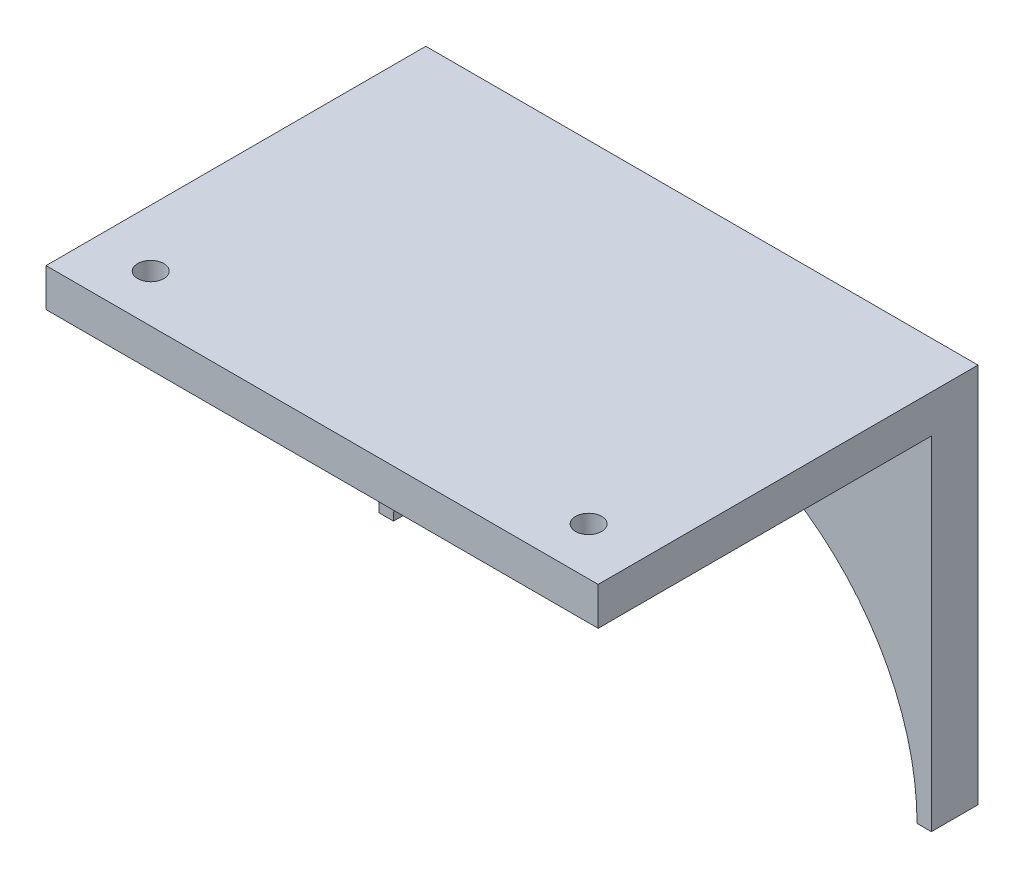
ISO-10303-21;
HEADER;
FILE_DESCRIPTION(('STEP AP214'),'2;1');
FILE_NAME('part.step','',(''),(''),'','','');
FILE_SCHEMA(('AUTOMOTIVE_DESIGN { 1 0 10303 214 1 1 1 1 }'));
ENDSEC;
DATA;
#1=APPLICATION_CONTEXT('core data for automotive mechanical design processes');
#2=APPLICATION_PROTOCOL_DEFINITION('international standard','automotive_design',2000,#1);
#3=PRODUCT_CONTEXT('',#1,'mechanical');
#4=PRODUCT('Part','Part','',(#3));
#5=PRODUCT_RELATED_PRODUCT_CATEGORY('part','',(#4));
#6=PRODUCT_DEFINITION_FORMATION('','',#4);
#7=PRODUCT_DEFINITION_CONTEXT('part definition',#1,'design');
#8=PRODUCT_DEFINITION('design','',#6,#7);
#9=PRODUCT_DEFINITION_SHAPE('','',#8);
#10=(LENGTH_UNIT() NAMED_UNIT(*) SI_UNIT(.MILLI.,.METRE.));
#11=(NAMED_UNIT(*) PLANE_ANGLE_UNIT() SI_UNIT($,.RADIAN.));
#12=(NAMED_UNIT(*) SI_UNIT($,.STERADIAN.) SOLID_ANGLE_UNIT());
#13=UNCERTAINTY_MEASURE_WITH_UNIT(LENGTH_MEASURE(1.E-05),#10,'distance_accuracy_value','');
#14=(GEOMETRIC_REPRESENTATION_CONTEXT(3) GLOBAL_UNCERTAINTY_ASSIGNED_CONTEXT((#13)) GLOBAL_UNIT_ASSIGNED_CONTEXT((#10,
#11,#12)) REPRESENTATION_CONTEXT('',''));
#15=CARTESIAN_POINT('',(0.,0.,0.));
#16=DIRECTION('',(0.,0.,1.));
#17=DIRECTION('',(1.,0.,0.));
#18=AXIS2_PLACEMENT_3D('',#15,#16,#17);
#19=CARTESIAN_POINT('',(0.,0.,1.8));
#20=DIRECTION('',(0.,0.,1.));
#21=DIRECTION('',(1.,0.,0.));
#22=AXIS2_PLACEMENT_3D('',#19,#20,#21);
#23=PLANE('',#22);
#24=DIRECTION('',(1.,0.,0.));
#25=VECTOR('',#24,1.);
#26=CARTESIAN_POINT('',(50.,0.,1.8));
#27=LINE('',#26,#25);
#28=CARTESIAN_POINT('',(50.,0.,1.8));
#29=VERTEX_POINT('',#28);
#30=CARTESIAN_POINT('',(55.,0.,1.8));
#31=VERTEX_POINT('',#30);
#32=EDGE_CURVE('E184',#29,#31,#27,.T.);
#33=ORIENTED_EDGE('',*,*,#32,.T.);
#34=CARTESIAN_POINT('',(0.,0.,1.8));
#35=DIRECTION('',(0.,0.,1.));
#36=DIRECTION('',(1.,0.,0.));
#37=AXIS2_PLACEMENT_3D('',#34,#35,#36);
#38=CIRCLE('',#37,55.);
#39=CARTESIAN_POINT('',(-55.,0.,1.8));
#40=VERTEX_POINT('',#39);
#41=EDGE_CURVE('E181',#31,#40,#38,.T.);
#42=ORIENTED_EDGE('',*,*,#41,.T.);
#43=DIRECTION('',(1.,0.,0.));
#44=VECTOR('',#43,1.);
#45=CARTESIAN_POINT('',(-50.,0.,1.8));
#46=LINE('',#45,#44);
#47=CARTESIAN_POINT('',(-50.,0.,1.8));
#48=VERTEX_POINT('',#47);
#49=EDGE_CURVE('E209',#40,#48,#46,.T.);
#50=ORIENTED_EDGE('',*,*,#49,.T.);
#51=CARTESIAN_POINT('',(0.,0.,1.8));
#52=DIRECTION('',(0.,0.,-1.));
#53=DIRECTION('',(1.,0.,0.));
#54=AXIS2_PLACEMENT_3D('',#51,#52,#53);
#55=CIRCLE('',#54,50.);
#56=EDGE_CURVE('E219',#48,#29,#55,.T.);
#57=ORIENTED_EDGE('',*,*,#56,.T.);
#58=EDGE_LOOP('',(#33,#42,#50,#57));
#59=FACE_BOUND('',#58,.T.);
#60=ADVANCED_FACE('F35',(#59),#23,.T.);
#61=CARTESIAN_POINT('',(58.,0.,1.8));
#62=DIRECTION('',(-1.,0.,0.));
#63=DIRECTION('',(0.,-1.,0.));
#64=AXIS2_PLACEMENT_3D('',#61,#62,#63);
#65=PLANE('',#64);
#66=DIRECTION('',(0.,1.,0.));
#67=VECTOR('',#66,1.);
#68=CARTESIAN_POINT('',(58.,0.,0.));
#69=LINE('',#68,#67);
#70=CARTESIAN_POINT('',(58.,0.,0.));
#71=VERTEX_POINT('',#70);
#72=CARTESIAN_POINT('',(58.,80.,0.));
#73=VERTEX_POINT('',#72);
#74=EDGE_CURVE('E190',#71,#73,#69,.T.);
#75=ORIENTED_EDGE('',*,*,#74,.T.);
#76=DIRECTION('',(0.,0.,-1.));
#77=VECTOR('',#76,1.);
#78=CARTESIAN_POINT('',(58.,80.,1.8));
#79=LINE('',#78,#77);
#80=CARTESIAN_POINT('',(58.,80.,79.8));
#81=VERTEX_POINT('',#80);
#82=EDGE_CURVE('E11',#81,#73,#79,.T.);
#83=ORIENTED_EDGE('',*,*,#82,.F.);
#84=DIRECTION('',(0.,1.,0.));
#85=VECTOR('',#84,1.);
#86=CARTESIAN_POINT('',(58.,72.,79.8));
#87=LINE('',#86,#85);
#88=CARTESIAN_POINT('',(58.,72.,79.8));
#89=VERTEX_POINT('',#88);
#90=EDGE_CURVE('E116',#89,#81,#87,.T.);
#91=ORIENTED_EDGE('',*,*,#90,.F.);
#92=DIRECTION('',(0.,0.,-1.));
#93=VECTOR('',#92,1.);
#94=CARTESIAN_POINT('',(58.,72.,0.));
#95=LINE('',#94,#93);
#96=CARTESIAN_POINT('',(58.,72.,9.8));
#97=VERTEX_POINT('',#96);
#98=EDGE_CURVE('E120',#89,#97,#95,.T.);
#99=ORIENTED_EDGE('',*,*,#98,.T.);
#100=DIRECTION('',(0.,1.,0.));
#101=VECTOR('',#100,1.);
#102=CARTESIAN_POINT('',(58.,0.,9.8));
#103=LINE('',#102,#101);
#104=CARTESIAN_POINT('',(58.,0.,9.8));
#105=VERTEX_POINT('',#104);
#106=EDGE_CURVE('E162',#105,#97,#103,.T.);
#107=ORIENTED_EDGE('',*,*,#106,.F.);
#108=DIRECTION('',(0.,0.,-1.));
#109=VECTOR('',#108,1.);
#110=CARTESIAN_POINT('',(58.,0.,1.8));
#111=LINE('',#110,#109);
#112=EDGE_CURVE('E210',#105,#71,#111,.T.);
#113=ORIENTED_EDGE('',*,*,#112,.T.);
#114=EDGE_LOOP('',(#75,#83,#91,#99,#107,#113));
#115=FACE_BOUND('',#114,.T.);
#116=ADVANCED_FACE('F37',(#115),#65,.F.);
#117=CARTESIAN_POINT('',(-58.,80.,1.8));
#118=DIRECTION('',(0.,-1.,0.));
#119=DIRECTION('',(1.,0.,0.));
#120=AXIS2_PLACEMENT_3D('',#117,#118,#119);
#121=PLANE('',#120);
#122=CARTESIAN_POINT('',(46.,80.,69.8));
#123=DIRECTION('',(0.,-1.,0.));
#124=DIRECTION('',(0.,0.,-1.));
#125=AXIS2_PLACEMENT_3D('',#122,#123,#124);
#126=CIRCLE('',#125,2.75);
#127=CARTESIAN_POINT('',(46.,80.,67.05));
#128=VERTEX_POINT('',#127);
#129=EDGE_CURVE('E270',#128,#128,#126,.T.);
#130=ORIENTED_EDGE('',*,*,#129,.T.);
#131=EDGE_LOOP('',(#130));
#132=FACE_BOUND('',#131,.T.);
#133=CARTESIAN_POINT('',(-46.,80.,69.8));
#134=DIRECTION('',(0.,-1.,0.));
#135=DIRECTION('',(0.,0.,-1.));
#136=AXIS2_PLACEMENT_3D('',#133,#134,#135);
#137=CIRCLE('',#136,2.75);
#138=CARTESIAN_POINT('',(-46.,80.,67.05));
#139=VERTEX_POINT('',#138);
#140=EDGE_CURVE('E139',#139,#139,#137,.T.);
#141=ORIENTED_EDGE('',*,*,#140,.T.);
#142=EDGE_LOOP('',(#141));
#143=FACE_BOUND('',#142,.T.);
#144=DIRECTION('',(-1.,0.,0.));
#145=VECTOR('',#144,1.);
#146=CARTESIAN_POINT('',(-58.,80.,0.));
#147=LINE('',#146,#145);
#148=CARTESIAN_POINT('',(-58.,80.,0.));
#149=VERTEX_POINT('',#148);
#150=EDGE_CURVE('E194',#73,#149,#147,.T.);
#151=ORIENTED_EDGE('',*,*,#150,.T.);
#152=DIRECTION('',(0.,0.,-1.));
#153=VECTOR('',#152,1.);
#154=CARTESIAN_POINT('',(-58.,80.,1.8));
#155=LINE('',#154,#153);
#156=CARTESIAN_POINT('',(-58.,80.,79.8));
#157=VERTEX_POINT('',#156);
#158=EDGE_CURVE('E44',#157,#149,#155,.T.);
#159=ORIENTED_EDGE('',*,*,#158,.F.);
#160=DIRECTION('',(1.,0.,0.));
#161=VECTOR('',#160,1.);
#162=CARTESIAN_POINT('',(0.,80.,79.8));
#163=LINE('',#162,#161);
#164=EDGE_CURVE('E137',#157,#81,#163,.T.);
#165=ORIENTED_EDGE('',*,*,#164,.T.);
#166=ORIENTED_EDGE('',*,*,#82,.T.);
#167=EDGE_LOOP('',(#151,#159,#165,#166));
#168=FACE_BOUND('',#167,.T.);
#169=ADVANCED_FACE('F235',(#132,#143,#168),#121,.F.);
#170=CARTESIAN_POINT('',(-58.,0.,1.8));
#171=DIRECTION('',(1.,0.,0.));
#172=DIRECTION('',(0.,0.,-1.));
#173=AXIS2_PLACEMENT_3D('',#170,#171,#172);
#174=PLANE('',#173);
#175=DIRECTION('',(0.,-1.,0.));
#176=VECTOR('',#175,1.);
#177=CARTESIAN_POINT('',(-58.,0.,0.));
#178=LINE('',#177,#176);
#179=CARTESIAN_POINT('',(-58.,0.,0.));
#180=VERTEX_POINT('',#179);
#181=EDGE_CURVE('E198',#149,#180,#178,.T.);
#182=ORIENTED_EDGE('',*,*,#181,.T.);
#183=DIRECTION('',(0.,0.,-1.));
#184=VECTOR('',#183,1.);
#185=CARTESIAN_POINT('',(-58.,0.,1.8));
#186=LINE('',#185,#184);
#187=CARTESIAN_POINT('',(-58.,0.,9.8));
#188=VERTEX_POINT('',#187);
#189=EDGE_CURVE('E159',#188,#180,#186,.T.);
#190=ORIENTED_EDGE('',*,*,#189,.F.);
#191=DIRECTION('',(0.,-1.,0.));
#192=VECTOR('',#191,1.);
#193=CARTESIAN_POINT('',(-58.,0.,9.8));
#194=LINE('',#193,#192);
#195=CARTESIAN_POINT('',(-58.,72.,9.8));
#196=VERTEX_POINT('',#195);
#197=EDGE_CURVE('E149',#196,#188,#194,.T.);
#198=ORIENTED_EDGE('',*,*,#197,.F.);
#199=DIRECTION('',(0.,0.,1.));
#200=VECTOR('',#199,1.);
#201=CARTESIAN_POINT('',(-58.,72.,0.));
#202=LINE('',#201,#200);
#203=CARTESIAN_POINT('',(-58.,72.,79.8));
#204=VERTEX_POINT('',#203);
#205=EDGE_CURVE('E126',#196,#204,#202,.T.);
#206=ORIENTED_EDGE('',*,*,#205,.T.);
#207=DIRECTION('',(0.,1.,0.));
#208=VECTOR('',#207,1.);
#209=CARTESIAN_POINT('',(-58.,72.,79.8));
#210=LINE('',#209,#208);
#211=EDGE_CURVE('E125',#204,#157,#210,.T.);
#212=ORIENTED_EDGE('',*,*,#211,.T.);
#213=ORIENTED_EDGE('',*,*,#158,.T.);
#214=EDGE_LOOP('',(#182,#190,#198,#206,#212,#213));
#215=FACE_BOUND('',#214,.T.);
#216=ADVANCED_FACE('F155',(#215),#174,.F.);
#217=CARTESIAN_POINT('',(-50.,0.,1.8));
#218=DIRECTION('',(0.,1.,0.));
#219=DIRECTION('',(-1.,0.,0.));
#220=AXIS2_PLACEMENT_3D('',#217,#218,#219);
#221=PLANE('',#220);
#222=DIRECTION('',(1.,0.,0.));
#223=VECTOR('',#222,1.);
#224=CARTESIAN_POINT('',(-50.,0.,0.));
#225=LINE('',#224,#223);
#226=CARTESIAN_POINT('',(-50.,0.,0.));
#227=VERTEX_POINT('',#226);
#228=EDGE_CURVE('E203',#180,#227,#225,.T.);
#229=ORIENTED_EDGE('',*,*,#228,.T.);
#230=DIRECTION('',(0.,0.,-1.));
#231=VECTOR('',#230,1.);
#232=CARTESIAN_POINT('',(-50.,0.,1.8));
#233=LINE('',#232,#231);
#234=EDGE_CURVE('E215',#48,#227,#233,.T.);
#235=ORIENTED_EDGE('',*,*,#234,.F.);
#236=ORIENTED_EDGE('',*,*,#49,.F.);
#237=DIRECTION('',(0.,0.,-1.));
#238=VECTOR('',#237,1.);
#239=CARTESIAN_POINT('',(-55.,0.,9.8));
#240=LINE('',#239,#238);
#241=CARTESIAN_POINT('',(-55.,0.,9.8));
#242=VERTEX_POINT('',#241);
#243=EDGE_CURVE('E60',#242,#40,#240,.T.);
#244=ORIENTED_EDGE('',*,*,#243,.F.);
#245=DIRECTION('',(1.,0.,0.));
#246=VECTOR('',#245,1.);
#247=CARTESIAN_POINT('',(0.,0.,9.8));
#248=LINE('',#247,#246);
#249=EDGE_CURVE('E161',#188,#242,#248,.T.);
#250=ORIENTED_EDGE('',*,*,#249,.F.);
#251=ORIENTED_EDGE('',*,*,#189,.T.);
#252=EDGE_LOOP('',(#229,#235,#236,#244,#250,#251));
#253=FACE_BOUND('',#252,.T.);
#254=ADVANCED_FACE('F237',(#253),#221,.F.);
#255=CARTESIAN_POINT('',(0.,0.,1.8));
#256=DIRECTION('',(0.,0.,-1.));
#257=DIRECTION('',(-1.,0.,0.));
#258=AXIS2_PLACEMENT_3D('',#255,#256,#257);
#259=CYLINDRICAL_SURFACE('',#258,50.);
#260=CARTESIAN_POINT('',(0.,0.,0.));
#261=DIRECTION('',(0.,0.,-1.));
#262=DIRECTION('',(1.,0.,0.));
#263=AXIS2_PLACEMENT_3D('',#260,#261,#262);
#264=CIRCLE('',#263,50.);
#265=CARTESIAN_POINT('',(50.,0.,0.));
#266=VERTEX_POINT('',#265);
#267=EDGE_CURVE('E205',#227,#266,#264,.T.);
#268=ORIENTED_EDGE('',*,*,#267,.T.);
#269=DIRECTION('',(0.,0.,-1.));
#270=VECTOR('',#269,1.);
#271=CARTESIAN_POINT('',(50.,0.,1.8));
#272=LINE('',#271,#270);
#273=EDGE_CURVE('E212',#29,#266,#272,.T.);
#274=ORIENTED_EDGE('',*,*,#273,.F.);
#275=ORIENTED_EDGE('',*,*,#56,.F.);
#276=ORIENTED_EDGE('',*,*,#234,.T.);
#277=EDGE_LOOP('',(#268,#274,#275,#276));
#278=FACE_BOUND('',#277,.T.);
#279=ADVANCED_FACE('F257',(#278),#259,.F.);
#280=CARTESIAN_POINT('',(50.,0.,1.8));
#281=DIRECTION('',(0.,1.,0.));
#282=DIRECTION('',(-1.,0.,0.));
#283=AXIS2_PLACEMENT_3D('',#280,#281,#282);
#284=PLANE('',#283);
#285=DIRECTION('',(1.,0.,0.));
#286=VECTOR('',#285,1.);
#287=CARTESIAN_POINT('',(50.,0.,0.));
#288=LINE('',#287,#286);
#289=EDGE_CURVE('E207',#266,#71,#288,.T.);
#290=ORIENTED_EDGE('',*,*,#289,.T.);
#291=ORIENTED_EDGE('',*,*,#112,.F.);
#292=DIRECTION('',(1.,0.,0.));
#293=VECTOR('',#292,1.);
#294=CARTESIAN_POINT('',(0.,0.,9.8));
#295=LINE('',#294,#293);
#296=CARTESIAN_POINT('',(55.,0.,9.8));
#297=VERTEX_POINT('',#296);
#298=EDGE_CURVE('E164',#297,#105,#295,.T.);
#299=ORIENTED_EDGE('',*,*,#298,.F.);
#300=DIRECTION('',(0.,0.,-1.));
#301=VECTOR('',#300,1.);
#302=CARTESIAN_POINT('',(55.,0.,9.8));
#303=LINE('',#302,#301);
#304=EDGE_CURVE('E188',#297,#31,#303,.T.);
#305=ORIENTED_EDGE('',*,*,#304,.T.);
#306=ORIENTED_EDGE('',*,*,#32,.F.);
#307=ORIENTED_EDGE('',*,*,#273,.T.);
#308=EDGE_LOOP('',(#290,#291,#299,#305,#306,#307));
#309=FACE_BOUND('',#308,.T.);
#310=ADVANCED_FACE('F226',(#309),#284,.F.);
#311=CARTESIAN_POINT('',(0.,0.,0.));
#312=DIRECTION('',(0.,0.,1.));
#313=DIRECTION('',(1.,0.,0.));
#314=AXIS2_PLACEMENT_3D('',#311,#312,#313);
#315=PLANE('',#314);
#316=ORIENTED_EDGE('',*,*,#74,.F.);
#317=ORIENTED_EDGE('',*,*,#289,.F.);
#318=ORIENTED_EDGE('',*,*,#267,.F.);
#319=ORIENTED_EDGE('',*,*,#228,.F.);
#320=ORIENTED_EDGE('',*,*,#181,.F.);
#321=ORIENTED_EDGE('',*,*,#150,.F.);
#322=EDGE_LOOP('',(#316,#317,#318,#319,#320,#321));
#323=FACE_BOUND('',#322,.T.);
#324=ADVANCED_FACE('F231',(#323),#315,.F.);
#325=CARTESIAN_POINT('',(0.,0.,9.8));
#326=DIRECTION('',(0.,0.,-1.));
#327=DIRECTION('',(-1.,0.,0.));
#328=AXIS2_PLACEMENT_3D('',#325,#326,#327);
#329=CYLINDRICAL_SURFACE('',#328,55.);
#330=ORIENTED_EDGE('',*,*,#41,.F.);
#331=ORIENTED_EDGE('',*,*,#304,.F.);
#332=CARTESIAN_POINT('',(0.,0.,9.8));
#333=DIRECTION('',(0.,0.,1.));
#334=DIRECTION('',(1.,0.,0.));
#335=AXIS2_PLACEMENT_3D('',#332,#333,#334);
#336=CIRCLE('',#335,55.);
#337=EDGE_CURVE('E166',#297,#242,#336,.T.);
#338=ORIENTED_EDGE('',*,*,#337,.T.);
#339=ORIENTED_EDGE('',*,*,#243,.T.);
#340=EDGE_LOOP('',(#330,#331,#338,#339));
#341=FACE_BOUND('',#340,.T.);
#342=ADVANCED_FACE('F240',(#341),#329,.F.);
#343=CARTESIAN_POINT('',(0.,0.,9.8));
#344=DIRECTION('',(0.,0.,1.));
#345=DIRECTION('',(1.,0.,0.));
#346=AXIS2_PLACEMENT_3D('',#343,#344,#345);
#347=PLANE('',#346);
#348=DIRECTION('',(1.,0.,0.));
#349=VECTOR('',#348,1.);
#350=CARTESIAN_POINT('',(0.,72.,9.8));
#351=LINE('',#350,#349);
#352=EDGE_CURVE('E52',#196,#97,#351,.T.);
#353=ORIENTED_EDGE('',*,*,#352,.F.);
#354=ORIENTED_EDGE('',*,*,#197,.T.);
#355=ORIENTED_EDGE('',*,*,#249,.T.);
#356=ORIENTED_EDGE('',*,*,#337,.F.);
#357=ORIENTED_EDGE('',*,*,#298,.T.);
#358=ORIENTED_EDGE('',*,*,#106,.T.);
#359=EDGE_LOOP('',(#353,#354,#355,#356,#357,#358));
#360=FACE_BOUND('',#359,.T.);
#361=ADVANCED_FACE('F239',(#360),#347,.T.);
#362=CARTESIAN_POINT('',(0.,72.,79.8));
#363=DIRECTION('',(0.,0.,1.));
#364=DIRECTION('',(1.,0.,0.));
#365=AXIS2_PLACEMENT_3D('',#362,#363,#364);
#366=PLANE('',#365);
#367=ORIENTED_EDGE('',*,*,#164,.F.);
#368=ORIENTED_EDGE('',*,*,#211,.F.);
#369=DIRECTION('',(1.,0.,0.));
#370=VECTOR('',#369,1.);
#371=CARTESIAN_POINT('',(0.,72.,79.8));
#372=LINE('',#371,#370);
#373=EDGE_CURVE('E132',#204,#89,#372,.T.);
#374=ORIENTED_EDGE('',*,*,#373,.T.);
#375=ORIENTED_EDGE('',*,*,#90,.T.);
#376=EDGE_LOOP('',(#367,#368,#374,#375));
#377=FACE_BOUND('',#376,.T.);
#378=ADVANCED_FACE('F135',(#377),#366,.T.);
#379=CARTESIAN_POINT('',(0.,72.,0.));
#380=DIRECTION('',(0.,1.,0.));
#381=DIRECTION('',(0.,0.,1.));
#382=AXIS2_PLACEMENT_3D('',#379,#380,#381);
#383=PLANE('',#382);
#384=CARTESIAN_POINT('',(46.,72.,69.8));
#385=DIRECTION('',(0.,-1.,0.));
#386=DIRECTION('',(0.,0.,-1.));
#387=AXIS2_PLACEMENT_3D('',#384,#385,#386);
#388=CIRCLE('',#387,2.75);
#389=CARTESIAN_POINT('',(46.,72.,67.05));
#390=VERTEX_POINT('',#389);
#391=EDGE_CURVE('E276',#390,#390,#388,.T.);
#392=ORIENTED_EDGE('',*,*,#391,.F.);
#393=EDGE_LOOP('',(#392));
#394=FACE_BOUND('',#393,.T.);
#395=CARTESIAN_POINT('',(-46.,72.,69.8));
#396=DIRECTION('',(0.,-1.,0.));
#397=DIRECTION('',(0.,0.,-1.));
#398=AXIS2_PLACEMENT_3D('',#395,#396,#397);
#399=CIRCLE('',#398,2.75);
#400=CARTESIAN_POINT('',(-46.,72.,67.05));
#401=VERTEX_POINT('',#400);
#402=EDGE_CURVE('E143',#401,#401,#399,.T.);
#403=ORIENTED_EDGE('',*,*,#402,.F.);
#404=EDGE_LOOP('',(#403));
#405=FACE_BOUND('',#404,.T.);
#406=ORIENTED_EDGE('',*,*,#373,.F.);
#407=ORIENTED_EDGE('',*,*,#205,.F.);
#408=ORIENTED_EDGE('',*,*,#352,.T.);
#409=ORIENTED_EDGE('',*,*,#98,.F.);
#410=EDGE_LOOP('',(#406,#407,#408,#409));
#411=FACE_BOUND('',#410,.T.);
#412=ADVANCED_FACE('F130',(#394,#405,#411),#383,.F.);
#413=CARTESIAN_POINT('',(-46.,80.,69.8));
#414=DIRECTION('',(0.,-1.,0.));
#415=DIRECTION('',(0.,0.,-1.));
#416=AXIS2_PLACEMENT_3D('',#413,#414,#415);
#417=CYLINDRICAL_SURFACE('',#416,2.75);
#418=ORIENTED_EDGE('',*,*,#140,.F.);
#419=EDGE_LOOP('',(#418));
#420=FACE_BOUND('',#419,.T.);
#421=ORIENTED_EDGE('',*,*,#402,.T.);
#422=EDGE_LOOP('',(#421));
#423=FACE_BOUND('',#422,.T.);
#424=ADVANCED_FACE('F285',(#420,#423),#417,.F.);
#425=CARTESIAN_POINT('',(46.,80.,69.8));
#426=DIRECTION('',(0.,-1.,0.));
#427=DIRECTION('',(0.,0.,-1.));
#428=AXIS2_PLACEMENT_3D('',#425,#426,#427);
#429=CYLINDRICAL_SURFACE('',#428,2.75);
#430=ORIENTED_EDGE('',*,*,#129,.F.);
#431=EDGE_LOOP('',(#430));
#432=FACE_BOUND('',#431,.T.);
#433=ORIENTED_EDGE('',*,*,#391,.T.);
#434=EDGE_LOOP('',(#433));
#435=FACE_BOUND('',#434,.T.);
#436=ADVANCED_FACE('F281',(#432,#435),#429,.F.);
#437=CLOSED_SHELL('',(#60,#116,#169,#216,#254,#279,#310,#324,#342,#361,#378,#412,#424,#436));
#438=MANIFOLD_SOLID_BREP('B2',#437);
#439=ADVANCED_BREP_SHAPE_REPRESENTATION('',(#18,#438),#14);
#440=SHAPE_DEFINITION_REPRESENTATION(#9,#439);
ENDSEC;
END-ISO-10303-21;
